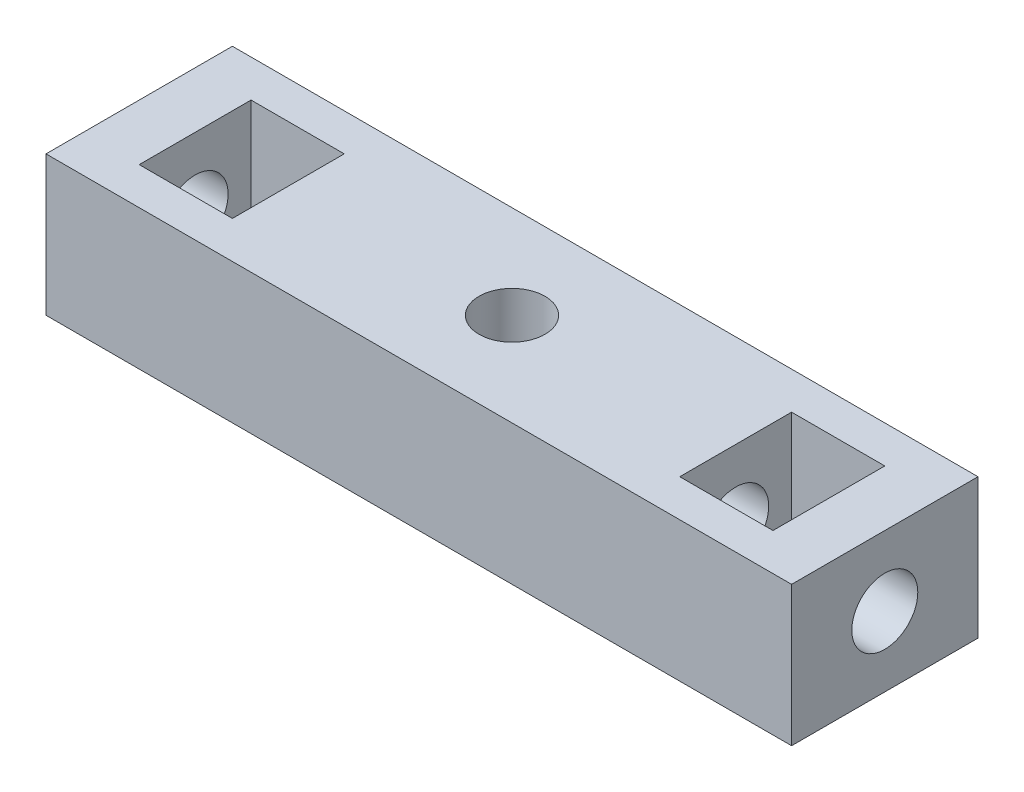
ISO-10303-21;
HEADER;
FILE_DESCRIPTION(('STEP AP214'),'2;1');
FILE_NAME('part.step','',(''),(''),'','','');
FILE_SCHEMA(('AUTOMOTIVE_DESIGN { 1 0 10303 214 1 1 1 1 }'));
ENDSEC;
DATA;
#1=APPLICATION_CONTEXT('core data for automotive mechanical design processes');
#2=APPLICATION_PROTOCOL_DEFINITION('international standard','automotive_design',2000,#1);
#3=PRODUCT_CONTEXT('',#1,'mechanical');
#4=PRODUCT('Part','Part','',(#3));
#5=PRODUCT_RELATED_PRODUCT_CATEGORY('part','',(#4));
#6=PRODUCT_DEFINITION_FORMATION('','',#4);
#7=PRODUCT_DEFINITION_CONTEXT('part definition',#1,'design');
#8=PRODUCT_DEFINITION('design','',#6,#7);
#9=PRODUCT_DEFINITION_SHAPE('','',#8);
#10=(LENGTH_UNIT() NAMED_UNIT(*) SI_UNIT(.MILLI.,.METRE.));
#11=(NAMED_UNIT(*) PLANE_ANGLE_UNIT() SI_UNIT($,.RADIAN.));
#12=(NAMED_UNIT(*) SI_UNIT($,.STERADIAN.) SOLID_ANGLE_UNIT());
#13=UNCERTAINTY_MEASURE_WITH_UNIT(LENGTH_MEASURE(1.E-05),#10,'distance_accuracy_value','');
#14=(GEOMETRIC_REPRESENTATION_CONTEXT(3) GLOBAL_UNCERTAINTY_ASSIGNED_CONTEXT((#13)) GLOBAL_UNIT_ASSIGNED_CONTEXT((#10,
#11,#12)) REPRESENTATION_CONTEXT('',''));
#15=CARTESIAN_POINT('',(0.,0.,0.));
#16=DIRECTION('',(0.,0.,1.));
#17=DIRECTION('',(1.,0.,0.));
#18=AXIS2_PLACEMENT_3D('',#15,#16,#17);
#19=CARTESIAN_POINT('',(25.4,4.7625,-57.15));
#20=DIRECTION('',(1.,0.,0.));
#21=DIRECTION('',(0.,0.,-1.));
#22=AXIS2_PLACEMENT_3D('',#19,#20,#21);
#23=CYLINDRICAL_SURFACE('',#22,2.24789999999999);
#24=CARTESIAN_POINT('',(21.59,4.7625,-57.15));
#25=DIRECTION('',(1.,0.,0.));
#26=DIRECTION('',(0.,0.,-1.));
#27=AXIS2_PLACEMENT_3D('',#24,#25,#26);
#28=CIRCLE('',#27,2.24789999999999);
#29=CARTESIAN_POINT('',(21.59,4.7625,-59.3979));
#30=VERTEX_POINT('',#29);
#31=EDGE_CURVE('E256',#30,#30,#28,.F.);
#32=ORIENTED_EDGE('',*,*,#31,.T.);
#33=EDGE_LOOP('',(#32));
#34=FACE_BOUND('',#33,.T.);
#35=CARTESIAN_POINT('',(25.4,4.7625,-57.15));
#36=DIRECTION('',(1.,0.,0.));
#37=DIRECTION('',(0.,0.,-1.));
#38=AXIS2_PLACEMENT_3D('',#35,#36,#37);
#39=CIRCLE('',#38,2.24789999999999);
#40=CARTESIAN_POINT('',(25.4,4.7625,-59.3979));
#41=VERTEX_POINT('',#40);
#42=EDGE_CURVE('E210',#41,#41,#39,.T.);
#43=ORIENTED_EDGE('',*,*,#42,.T.);
#44=EDGE_LOOP('',(#43));
#45=FACE_BOUND('',#44,.T.);
#46=ADVANCED_FACE('F42',(#34,#45),#23,.F.);
#47=CARTESIAN_POINT('',(25.4,9.525,63.5));
#48=DIRECTION('',(-1.,0.,0.));
#49=DIRECTION('',(0.,0.,1.));
#50=AXIS2_PLACEMENT_3D('',#47,#48,#49);
#51=PLANE('',#50);
#52=ORIENTED_EDGE('',*,*,#42,.F.);
#53=EDGE_LOOP('',(#52));
#54=FACE_BOUND('',#53,.T.);
#55=DIRECTION('',(0.,0.,-1.));
#56=VECTOR('',#55,1.);
#57=CARTESIAN_POINT('',(25.4,9.525,63.5));
#58=LINE('',#57,#56);
#59=CARTESIAN_POINT('',(25.4,9.525,-50.8));
#60=VERTEX_POINT('',#59);
#61=CARTESIAN_POINT('',(25.4,9.525,-63.5));
#62=VERTEX_POINT('',#61);
#63=EDGE_CURVE('E239',#60,#62,#58,.T.);
#64=ORIENTED_EDGE('',*,*,#63,.F.);
#65=DIRECTION('',(0.,1.,0.));
#66=VECTOR('',#65,1.);
#67=CARTESIAN_POINT('',(25.4,0.,-50.8));
#68=LINE('',#67,#66);
#69=CARTESIAN_POINT('',(25.4,0.,-50.8));
#70=VERTEX_POINT('',#69);
#71=EDGE_CURVE('E232',#70,#60,#68,.T.);
#72=ORIENTED_EDGE('',*,*,#71,.F.);
#73=DIRECTION('',(0.,0.,-1.));
#74=VECTOR('',#73,1.);
#75=CARTESIAN_POINT('',(25.4,0.,63.5));
#76=LINE('',#75,#74);
#77=CARTESIAN_POINT('',(25.4,0.,-63.5));
#78=VERTEX_POINT('',#77);
#79=EDGE_CURVE('E237',#70,#78,#76,.T.);
#80=ORIENTED_EDGE('',*,*,#79,.T.);
#81=DIRECTION('',(0.,-1.,0.));
#82=VECTOR('',#81,1.);
#83=CARTESIAN_POINT('',(25.4,9.525,-63.5));
#84=LINE('',#83,#82);
#85=EDGE_CURVE('E11',#62,#78,#84,.T.);
#86=ORIENTED_EDGE('',*,*,#85,.F.);
#87=EDGE_LOOP('',(#64,#72,#80,#86));
#88=FACE_BOUND('',#87,.T.);
#89=ADVANCED_FACE('F44',(#54,#88),#51,.F.);
#90=CARTESIAN_POINT('',(-25.4,9.525,-63.5));
#91=DIRECTION('',(0.,0.,1.));
#92=DIRECTION('',(1.,0.,0.));
#93=AXIS2_PLACEMENT_3D('',#90,#91,#92);
#94=PLANE('',#93);
#95=DIRECTION('',(-1.,0.,0.));
#96=VECTOR('',#95,1.);
#97=CARTESIAN_POINT('',(-25.4,0.,-63.5));
#98=LINE('',#97,#96);
#99=CARTESIAN_POINT('',(-25.4,0.,-63.5));
#100=VERTEX_POINT('',#99);
#101=EDGE_CURVE('E248',#78,#100,#98,.T.);
#102=ORIENTED_EDGE('',*,*,#101,.T.);
#103=DIRECTION('',(0.,-1.,0.));
#104=VECTOR('',#103,1.);
#105=CARTESIAN_POINT('',(-25.4,9.525,-63.5));
#106=LINE('',#105,#104);
#107=CARTESIAN_POINT('',(-25.4,9.525,-63.5));
#108=VERTEX_POINT('',#107);
#109=EDGE_CURVE('E51',#108,#100,#106,.T.);
#110=ORIENTED_EDGE('',*,*,#109,.F.);
#111=DIRECTION('',(-1.,0.,0.));
#112=VECTOR('',#111,1.);
#113=CARTESIAN_POINT('',(-25.4,9.525,-63.5));
#114=LINE('',#113,#112);
#115=EDGE_CURVE('E241',#62,#108,#114,.T.);
#116=ORIENTED_EDGE('',*,*,#115,.F.);
#117=ORIENTED_EDGE('',*,*,#85,.T.);
#118=EDGE_LOOP('',(#102,#110,#116,#117));
#119=FACE_BOUND('',#118,.T.);
#120=ADVANCED_FACE('F292',(#119),#94,.F.);
#121=CARTESIAN_POINT('',(-25.4,9.525,63.5));
#122=DIRECTION('',(1.,0.,0.));
#123=DIRECTION('',(0.,0.,-1.));
#124=AXIS2_PLACEMENT_3D('',#121,#122,#123);
#125=PLANE('',#124);
#126=CARTESIAN_POINT('',(-25.4,4.7625,-57.15));
#127=DIRECTION('',(-1.,0.,0.));
#128=DIRECTION('',(0.,0.,1.));
#129=AXIS2_PLACEMENT_3D('',#126,#127,#128);
#130=CIRCLE('',#129,2.24789999999999);
#131=CARTESIAN_POINT('',(-25.4,4.7625,-54.9021));
#132=VERTEX_POINT('',#131);
#133=EDGE_CURVE('E216',#132,#132,#130,.T.);
#134=ORIENTED_EDGE('',*,*,#133,.F.);
#135=EDGE_LOOP('',(#134));
#136=FACE_BOUND('',#135,.T.);
#137=DIRECTION('',(0.,0.,1.));
#138=VECTOR('',#137,1.);
#139=CARTESIAN_POINT('',(-25.4,0.,63.5));
#140=LINE('',#139,#138);
#141=CARTESIAN_POINT('',(-25.4,0.,-50.8));
#142=VERTEX_POINT('',#141);
#143=EDGE_CURVE('E242',#100,#142,#140,.T.);
#144=ORIENTED_EDGE('',*,*,#143,.T.);
#145=DIRECTION('',(0.,1.,0.));
#146=VECTOR('',#145,1.);
#147=CARTESIAN_POINT('',(-25.4,0.,-50.8));
#148=LINE('',#147,#146);
#149=CARTESIAN_POINT('',(-25.4,9.525,-50.8));
#150=VERTEX_POINT('',#149);
#151=EDGE_CURVE('E234',#142,#150,#148,.T.);
#152=ORIENTED_EDGE('',*,*,#151,.T.);
#153=DIRECTION('',(0.,0.,1.));
#154=VECTOR('',#153,1.);
#155=CARTESIAN_POINT('',(-25.4,9.525,63.5));
#156=LINE('',#155,#154);
#157=EDGE_CURVE('E244',#108,#150,#156,.T.);
#158=ORIENTED_EDGE('',*,*,#157,.F.);
#159=ORIENTED_EDGE('',*,*,#109,.T.);
#160=EDGE_LOOP('',(#144,#152,#158,#159));
#161=FACE_BOUND('',#160,.T.);
#162=ADVANCED_FACE('F344',(#136,#161),#125,.F.);
#163=CARTESIAN_POINT('',(0.,9.525,0.));
#164=DIRECTION('',(0.,-1.,0.));
#165=DIRECTION('',(0.,0.,-1.));
#166=AXIS2_PLACEMENT_3D('',#163,#164,#165);
#167=PLANE('',#166);
#168=DIRECTION('',(-1.,0.,0.));
#169=VECTOR('',#168,1.);
#170=CARTESIAN_POINT('',(-21.59,9.525,-60.96));
#171=LINE('',#170,#169);
#172=CARTESIAN_POINT('',(-15.24,9.525,-60.96));
#173=VERTEX_POINT('',#172);
#174=CARTESIAN_POINT('',(-21.59,9.525,-60.96));
#175=VERTEX_POINT('',#174);
#176=EDGE_CURVE('E170',#173,#175,#171,.T.);
#177=ORIENTED_EDGE('',*,*,#176,.F.);
#178=DIRECTION('',(0.,0.,-1.));
#179=VECTOR('',#178,1.);
#180=CARTESIAN_POINT('',(-15.24,9.525,-53.34));
#181=LINE('',#180,#179);
#182=CARTESIAN_POINT('',(-15.24,9.525,-53.34));
#183=VERTEX_POINT('',#182);
#184=EDGE_CURVE('E59',#183,#173,#181,.T.);
#185=ORIENTED_EDGE('',*,*,#184,.F.);
#186=DIRECTION('',(1.,0.,0.));
#187=VECTOR('',#186,1.);
#188=CARTESIAN_POINT('',(-21.59,9.525,-53.34));
#189=LINE('',#188,#187);
#190=CARTESIAN_POINT('',(-21.59,9.525,-53.34));
#191=VERTEX_POINT('',#190);
#192=EDGE_CURVE('E161',#191,#183,#189,.T.);
#193=ORIENTED_EDGE('',*,*,#192,.F.);
#194=DIRECTION('',(0.,0.,1.));
#195=VECTOR('',#194,1.);
#196=CARTESIAN_POINT('',(-21.59,9.525,-53.34));
#197=LINE('',#196,#195);
#198=EDGE_CURVE('E164',#175,#191,#197,.T.);
#199=ORIENTED_EDGE('',*,*,#198,.F.);
#200=EDGE_LOOP('',(#177,#185,#193,#199));
#201=FACE_BOUND('',#200,.T.);
#202=DIRECTION('',(-1.,0.,0.));
#203=VECTOR('',#202,1.);
#204=CARTESIAN_POINT('',(15.24,9.525,-60.96));
#205=LINE('',#204,#203);
#206=CARTESIAN_POINT('',(21.59,9.525,-60.96));
#207=VERTEX_POINT('',#206);
#208=CARTESIAN_POINT('',(15.24,9.525,-60.96));
#209=VERTEX_POINT('',#208);
#210=EDGE_CURVE('E196',#207,#209,#205,.T.);
#211=ORIENTED_EDGE('',*,*,#210,.F.);
#212=DIRECTION('',(0.,0.,-1.));
#213=VECTOR('',#212,1.);
#214=CARTESIAN_POINT('',(21.59,9.525,-53.34));
#215=LINE('',#214,#213);
#216=CARTESIAN_POINT('',(21.59,9.525,-53.34));
#217=VERTEX_POINT('',#216);
#218=EDGE_CURVE('E67',#217,#207,#215,.T.);
#219=ORIENTED_EDGE('',*,*,#218,.F.);
#220=DIRECTION('',(1.,0.,0.));
#221=VECTOR('',#220,1.);
#222=CARTESIAN_POINT('',(15.24,9.525,-53.34));
#223=LINE('',#222,#221);
#224=CARTESIAN_POINT('',(15.24,9.525,-53.34));
#225=VERTEX_POINT('',#224);
#226=EDGE_CURVE('E189',#225,#217,#223,.T.);
#227=ORIENTED_EDGE('',*,*,#226,.F.);
#228=DIRECTION('',(0.,0.,1.));
#229=VECTOR('',#228,1.);
#230=CARTESIAN_POINT('',(15.24,9.525,-53.34));
#231=LINE('',#230,#229);
#232=EDGE_CURVE('E192',#209,#225,#231,.T.);
#233=ORIENTED_EDGE('',*,*,#232,.F.);
#234=EDGE_LOOP('',(#211,#219,#227,#233));
#235=FACE_BOUND('',#234,.T.);
#236=CARTESIAN_POINT('',(0.,9.525,-57.15));
#237=DIRECTION('',(0.,1.,0.));
#238=DIRECTION('',(0.,0.,1.));
#239=AXIS2_PLACEMENT_3D('',#236,#237,#238);
#240=CIRCLE('',#239,2.2479);
#241=CARTESIAN_POINT('',(0.,9.525,-54.9021));
#242=VERTEX_POINT('',#241);
#243=EDGE_CURVE('E222',#242,#242,#240,.T.);
#244=ORIENTED_EDGE('',*,*,#243,.F.);
#245=EDGE_LOOP('',(#244));
#246=FACE_BOUND('',#245,.T.);
#247=ORIENTED_EDGE('',*,*,#157,.T.);
#248=DIRECTION('',(-1.,0.,0.));
#249=VECTOR('',#248,1.);
#250=CARTESIAN_POINT('',(-25.4,9.525,-50.8));
#251=LINE('',#250,#249);
#252=EDGE_CURVE('E228',#60,#150,#251,.T.);
#253=ORIENTED_EDGE('',*,*,#252,.F.);
#254=ORIENTED_EDGE('',*,*,#63,.T.);
#255=ORIENTED_EDGE('',*,*,#115,.T.);
#256=EDGE_LOOP('',(#247,#253,#254,#255));
#257=FACE_BOUND('',#256,.T.);
#258=ADVANCED_FACE('F326',(#201,#235,#246,#257),#167,.F.);
#259=CARTESIAN_POINT('',(0.,0.,0.));
#260=DIRECTION('',(0.,-1.,0.));
#261=DIRECTION('',(0.,0.,-1.));
#262=AXIS2_PLACEMENT_3D('',#259,#260,#261);
#263=PLANE('',#262);
#264=DIRECTION('',(0.,0.,-1.));
#265=VECTOR('',#264,1.);
#266=CARTESIAN_POINT('',(-15.24,0.,-53.34));
#267=LINE('',#266,#265);
#268=CARTESIAN_POINT('',(-15.24,0.,-53.34));
#269=VERTEX_POINT('',#268);
#270=CARTESIAN_POINT('',(-15.24,0.,-60.96));
#271=VERTEX_POINT('',#270);
#272=EDGE_CURVE('E142',#269,#271,#267,.T.);
#273=ORIENTED_EDGE('',*,*,#272,.T.);
#274=DIRECTION('',(-1.,0.,0.));
#275=VECTOR('',#274,1.);
#276=CARTESIAN_POINT('',(-21.59,0.,-60.96));
#277=LINE('',#276,#275);
#278=CARTESIAN_POINT('',(-21.59,0.,-60.96));
#279=VERTEX_POINT('',#278);
#280=EDGE_CURVE('E152',#271,#279,#277,.T.);
#281=ORIENTED_EDGE('',*,*,#280,.T.);
#282=DIRECTION('',(0.,0.,1.));
#283=VECTOR('',#282,1.);
#284=CARTESIAN_POINT('',(-21.59,0.,-53.34));
#285=LINE('',#284,#283);
#286=CARTESIAN_POINT('',(-21.59,0.,-53.34));
#287=VERTEX_POINT('',#286);
#288=EDGE_CURVE('E156',#279,#287,#285,.T.);
#289=ORIENTED_EDGE('',*,*,#288,.T.);
#290=DIRECTION('',(1.,0.,0.));
#291=VECTOR('',#290,1.);
#292=CARTESIAN_POINT('',(-21.59,0.,-53.34));
#293=LINE('',#292,#291);
#294=EDGE_CURVE('E148',#287,#269,#293,.T.);
#295=ORIENTED_EDGE('',*,*,#294,.T.);
#296=EDGE_LOOP('',(#273,#281,#289,#295));
#297=FACE_BOUND('',#296,.T.);
#298=DIRECTION('',(0.,0.,-1.));
#299=VECTOR('',#298,1.);
#300=CARTESIAN_POINT('',(21.59,0.,-53.34));
#301=LINE('',#300,#299);
#302=CARTESIAN_POINT('',(21.59,0.,-53.34));
#303=VERTEX_POINT('',#302);
#304=CARTESIAN_POINT('',(21.59,0.,-60.96));
#305=VERTEX_POINT('',#304);
#306=EDGE_CURVE('E193',#303,#305,#301,.T.);
#307=ORIENTED_EDGE('',*,*,#306,.T.);
#308=DIRECTION('',(-1.,0.,0.));
#309=VECTOR('',#308,1.);
#310=CARTESIAN_POINT('',(15.24,0.,-60.96));
#311=LINE('',#310,#309);
#312=CARTESIAN_POINT('',(15.24,0.,-60.96));
#313=VERTEX_POINT('',#312);
#314=EDGE_CURVE('E205',#305,#313,#311,.T.);
#315=ORIENTED_EDGE('',*,*,#314,.T.);
#316=DIRECTION('',(0.,0.,1.));
#317=VECTOR('',#316,1.);
#318=CARTESIAN_POINT('',(15.24,0.,-53.34));
#319=LINE('',#318,#317);
#320=CARTESIAN_POINT('',(15.24,0.,-53.34));
#321=VERTEX_POINT('',#320);
#322=EDGE_CURVE('E202',#313,#321,#319,.T.);
#323=ORIENTED_EDGE('',*,*,#322,.T.);
#324=DIRECTION('',(1.,0.,0.));
#325=VECTOR('',#324,1.);
#326=CARTESIAN_POINT('',(15.24,0.,-53.34));
#327=LINE('',#326,#325);
#328=EDGE_CURVE('E182',#321,#303,#327,.T.);
#329=ORIENTED_EDGE('',*,*,#328,.T.);
#330=EDGE_LOOP('',(#307,#315,#323,#329));
#331=FACE_BOUND('',#330,.T.);
#332=CARTESIAN_POINT('',(0.,0.,-57.15));
#333=DIRECTION('',(0.,1.,0.));
#334=DIRECTION('',(0.,0.,1.));
#335=AXIS2_PLACEMENT_3D('',#332,#333,#334);
#336=CIRCLE('',#335,2.2479);
#337=CARTESIAN_POINT('',(0.,0.,-54.9021));
#338=VERTEX_POINT('',#337);
#339=EDGE_CURVE('E225',#338,#338,#336,.T.);
#340=ORIENTED_EDGE('',*,*,#339,.T.);
#341=EDGE_LOOP('',(#340));
#342=FACE_BOUND('',#341,.T.);
#343=DIRECTION('',(-1.,0.,0.));
#344=VECTOR('',#343,1.);
#345=CARTESIAN_POINT('',(-25.4,0.,-50.8));
#346=LINE('',#345,#344);
#347=EDGE_CURVE('E229',#70,#142,#346,.T.);
#348=ORIENTED_EDGE('',*,*,#347,.T.);
#349=ORIENTED_EDGE('',*,*,#143,.F.);
#350=ORIENTED_EDGE('',*,*,#101,.F.);
#351=ORIENTED_EDGE('',*,*,#79,.F.);
#352=EDGE_LOOP('',(#348,#349,#350,#351));
#353=FACE_BOUND('',#352,.T.);
#354=ADVANCED_FACE('F158',(#297,#331,#342,#353),#263,.T.);
#355=CARTESIAN_POINT('',(-25.4,0.,-50.8));
#356=DIRECTION('',(0.,0.,-1.));
#357=DIRECTION('',(-1.,0.,0.));
#358=AXIS2_PLACEMENT_3D('',#355,#356,#357);
#359=PLANE('',#358);
#360=ORIENTED_EDGE('',*,*,#252,.T.);
#361=ORIENTED_EDGE('',*,*,#151,.F.);
#362=ORIENTED_EDGE('',*,*,#347,.F.);
#363=ORIENTED_EDGE('',*,*,#71,.T.);
#364=EDGE_LOOP('',(#360,#361,#362,#363));
#365=FACE_BOUND('',#364,.T.);
#366=ADVANCED_FACE('F334',(#365),#359,.F.);
#367=CARTESIAN_POINT('',(0.,9.525,-57.15));
#368=DIRECTION('',(0.,1.,0.));
#369=DIRECTION('',(0.,0.,1.));
#370=AXIS2_PLACEMENT_3D('',#367,#368,#369);
#371=CYLINDRICAL_SURFACE('',#370,2.2479);
#372=ORIENTED_EDGE('',*,*,#339,.F.);
#373=EDGE_LOOP('',(#372));
#374=FACE_BOUND('',#373,.T.);
#375=ORIENTED_EDGE('',*,*,#243,.T.);
#376=EDGE_LOOP('',(#375));
#377=FACE_BOUND('',#376,.T.);
#378=ADVANCED_FACE('F375',(#374,#377),#371,.F.);
#379=CARTESIAN_POINT('',(-25.4,4.7625,-57.15));
#380=DIRECTION('',(-1.,0.,0.));
#381=DIRECTION('',(0.,0.,1.));
#382=AXIS2_PLACEMENT_3D('',#379,#380,#381);
#383=CYLINDRICAL_SURFACE('',#382,2.24789999999999);
#384=CARTESIAN_POINT('',(-21.59,4.7625,-57.15));
#385=DIRECTION('',(-1.,0.,0.));
#386=DIRECTION('',(0.,0.,1.));
#387=AXIS2_PLACEMENT_3D('',#384,#385,#386);
#388=CIRCLE('',#387,2.24789999999999);
#389=CARTESIAN_POINT('',(-21.59,4.7625,-54.9021));
#390=VERTEX_POINT('',#389);
#391=EDGE_CURVE('E258',#390,#390,#388,.F.);
#392=ORIENTED_EDGE('',*,*,#391,.T.);
#393=EDGE_LOOP('',(#392));
#394=FACE_BOUND('',#393,.T.);
#395=ORIENTED_EDGE('',*,*,#133,.T.);
#396=EDGE_LOOP('',(#395));
#397=FACE_BOUND('',#396,.T.);
#398=ADVANCED_FACE('F319',(#394,#397),#383,.F.);
#399=CARTESIAN_POINT('',(21.59,0.,-53.34));
#400=DIRECTION('',(1.,0.,0.));
#401=DIRECTION('',(0.,0.,-1.));
#402=AXIS2_PLACEMENT_3D('',#399,#400,#401);
#403=PLANE('',#402);
#404=ORIENTED_EDGE('',*,*,#218,.T.);
#405=DIRECTION('',(0.,1.,0.));
#406=VECTOR('',#405,1.);
#407=CARTESIAN_POINT('',(21.59,0.,-60.96));
#408=LINE('',#407,#406);
#409=EDGE_CURVE('E180',#305,#207,#408,.T.);
#410=ORIENTED_EDGE('',*,*,#409,.F.);
#411=ORIENTED_EDGE('',*,*,#306,.F.);
#412=DIRECTION('',(0.,1.,0.));
#413=VECTOR('',#412,1.);
#414=CARTESIAN_POINT('',(21.59,0.,-53.34));
#415=LINE('',#414,#413);
#416=EDGE_CURVE('E187',#303,#217,#415,.T.);
#417=ORIENTED_EDGE('',*,*,#416,.T.);
#418=EDGE_LOOP('',(#404,#410,#411,#417));
#419=FACE_BOUND('',#418,.T.);
#420=ORIENTED_EDGE('',*,*,#31,.F.);
#421=EDGE_LOOP('',(#420));
#422=FACE_BOUND('',#421,.T.);
#423=ADVANCED_FACE('F311',(#419,#422),#403,.F.);
#424=CARTESIAN_POINT('',(15.24,0.,-53.34));
#425=DIRECTION('',(-1.,0.,0.));
#426=DIRECTION('',(0.,0.,1.));
#427=AXIS2_PLACEMENT_3D('',#424,#425,#426);
#428=PLANE('',#427);
#429=ORIENTED_EDGE('',*,*,#232,.T.);
#430=DIRECTION('',(0.,1.,0.));
#431=VECTOR('',#430,1.);
#432=CARTESIAN_POINT('',(15.24,0.,-53.34));
#433=LINE('',#432,#431);
#434=EDGE_CURVE('E185',#321,#225,#433,.T.);
#435=ORIENTED_EDGE('',*,*,#434,.F.);
#436=ORIENTED_EDGE('',*,*,#322,.F.);
#437=DIRECTION('',(0.,1.,0.));
#438=VECTOR('',#437,1.);
#439=CARTESIAN_POINT('',(15.24,0.,-60.96));
#440=LINE('',#439,#438);
#441=EDGE_CURVE('E183',#313,#209,#440,.T.);
#442=ORIENTED_EDGE('',*,*,#441,.T.);
#443=EDGE_LOOP('',(#429,#435,#436,#442));
#444=FACE_BOUND('',#443,.T.);
#445=CARTESIAN_POINT('',(15.24,4.7625,-57.15));
#446=DIRECTION('',(-1.,0.,0.));
#447=DIRECTION('',(0.,0.,1.));
#448=AXIS2_PLACEMENT_3D('',#445,#446,#447);
#449=CIRCLE('',#448,2.24789999999999);
#450=CARTESIAN_POINT('',(15.24,4.7625,-54.9021));
#451=VERTEX_POINT('',#450);
#452=EDGE_CURVE('E176',#451,#451,#449,.F.);
#453=ORIENTED_EDGE('',*,*,#452,.F.);
#454=EDGE_LOOP('',(#453));
#455=FACE_BOUND('',#454,.T.);
#456=ADVANCED_FACE('F309',(#444,#455),#428,.F.);
#457=CARTESIAN_POINT('',(15.24,0.,-53.34));
#458=DIRECTION('',(0.,0.,1.));
#459=DIRECTION('',(1.,0.,0.));
#460=AXIS2_PLACEMENT_3D('',#457,#458,#459);
#461=PLANE('',#460);
#462=ORIENTED_EDGE('',*,*,#226,.T.);
#463=ORIENTED_EDGE('',*,*,#416,.F.);
#464=ORIENTED_EDGE('',*,*,#328,.F.);
#465=ORIENTED_EDGE('',*,*,#434,.T.);
#466=EDGE_LOOP('',(#462,#463,#464,#465));
#467=FACE_BOUND('',#466,.T.);
#468=ADVANCED_FACE('F278',(#467),#461,.F.);
#469=CARTESIAN_POINT('',(15.24,0.,-60.96));
#470=DIRECTION('',(0.,0.,-1.));
#471=DIRECTION('',(-1.,0.,0.));
#472=AXIS2_PLACEMENT_3D('',#469,#470,#471);
#473=PLANE('',#472);
#474=ORIENTED_EDGE('',*,*,#210,.T.);
#475=ORIENTED_EDGE('',*,*,#441,.F.);
#476=ORIENTED_EDGE('',*,*,#314,.F.);
#477=ORIENTED_EDGE('',*,*,#409,.T.);
#478=EDGE_LOOP('',(#474,#475,#476,#477));
#479=FACE_BOUND('',#478,.T.);
#480=ADVANCED_FACE('F269',(#479),#473,.F.);
#481=CARTESIAN_POINT('',(-15.24,0.,-53.34));
#482=DIRECTION('',(1.,0.,0.));
#483=DIRECTION('',(0.,0.,-1.));
#484=AXIS2_PLACEMENT_3D('',#481,#482,#483);
#485=PLANE('',#484);
#486=ORIENTED_EDGE('',*,*,#184,.T.);
#487=DIRECTION('',(0.,1.,0.));
#488=VECTOR('',#487,1.);
#489=CARTESIAN_POINT('',(-15.24,0.,-60.96));
#490=LINE('',#489,#488);
#491=EDGE_CURVE('E137',#271,#173,#490,.T.);
#492=ORIENTED_EDGE('',*,*,#491,.F.);
#493=ORIENTED_EDGE('',*,*,#272,.F.);
#494=DIRECTION('',(0.,1.,0.));
#495=VECTOR('',#494,1.);
#496=CARTESIAN_POINT('',(-15.24,0.,-53.34));
#497=LINE('',#496,#495);
#498=EDGE_CURVE('E174',#269,#183,#497,.T.);
#499=ORIENTED_EDGE('',*,*,#498,.T.);
#500=EDGE_LOOP('',(#486,#492,#493,#499));
#501=FACE_BOUND('',#500,.T.);
#502=CARTESIAN_POINT('',(-15.24,4.7625,-57.15));
#503=DIRECTION('',(1.,0.,0.));
#504=DIRECTION('',(0.,0.,-1.));
#505=AXIS2_PLACEMENT_3D('',#502,#503,#504);
#506=CIRCLE('',#505,2.24789999999999);
#507=CARTESIAN_POINT('',(-15.24,4.7625,-59.3979));
#508=VERTEX_POINT('',#507);
#509=EDGE_CURVE('E46',#508,#508,#506,.F.);
#510=ORIENTED_EDGE('',*,*,#509,.F.);
#511=EDGE_LOOP('',(#510));
#512=FACE_BOUND('',#511,.T.);
#513=ADVANCED_FACE('F139',(#501,#512),#485,.F.);
#514=CARTESIAN_POINT('',(-21.59,0.,-53.34));
#515=DIRECTION('',(-1.,0.,0.));
#516=DIRECTION('',(0.,0.,1.));
#517=AXIS2_PLACEMENT_3D('',#514,#515,#516);
#518=PLANE('',#517);
#519=ORIENTED_EDGE('',*,*,#198,.T.);
#520=DIRECTION('',(0.,1.,0.));
#521=VECTOR('',#520,1.);
#522=CARTESIAN_POINT('',(-21.59,0.,-53.34));
#523=LINE('',#522,#521);
#524=EDGE_CURVE('E177',#287,#191,#523,.T.);
#525=ORIENTED_EDGE('',*,*,#524,.F.);
#526=ORIENTED_EDGE('',*,*,#288,.F.);
#527=DIRECTION('',(0.,1.,0.));
#528=VECTOR('',#527,1.);
#529=CARTESIAN_POINT('',(-21.59,0.,-60.96));
#530=LINE('',#529,#528);
#531=EDGE_CURVE('E147',#279,#175,#530,.T.);
#532=ORIENTED_EDGE('',*,*,#531,.T.);
#533=EDGE_LOOP('',(#519,#525,#526,#532));
#534=FACE_BOUND('',#533,.T.);
#535=ORIENTED_EDGE('',*,*,#391,.F.);
#536=EDGE_LOOP('',(#535));
#537=FACE_BOUND('',#536,.T.);
#538=ADVANCED_FACE('F268',(#534,#537),#518,.F.);
#539=CARTESIAN_POINT('',(-21.59,0.,-53.34));
#540=DIRECTION('',(0.,0.,1.));
#541=DIRECTION('',(1.,0.,0.));
#542=AXIS2_PLACEMENT_3D('',#539,#540,#541);
#543=PLANE('',#542);
#544=ORIENTED_EDGE('',*,*,#192,.T.);
#545=ORIENTED_EDGE('',*,*,#498,.F.);
#546=ORIENTED_EDGE('',*,*,#294,.F.);
#547=ORIENTED_EDGE('',*,*,#524,.T.);
#548=EDGE_LOOP('',(#544,#545,#546,#547));
#549=FACE_BOUND('',#548,.T.);
#550=ADVANCED_FACE('F275',(#549),#543,.F.);
#551=CARTESIAN_POINT('',(-21.59,0.,-60.96));
#552=DIRECTION('',(0.,0.,-1.));
#553=DIRECTION('',(-1.,0.,0.));
#554=AXIS2_PLACEMENT_3D('',#551,#552,#553);
#555=PLANE('',#554);
#556=ORIENTED_EDGE('',*,*,#176,.T.);
#557=ORIENTED_EDGE('',*,*,#531,.F.);
#558=ORIENTED_EDGE('',*,*,#280,.F.);
#559=ORIENTED_EDGE('',*,*,#491,.T.);
#560=EDGE_LOOP('',(#556,#557,#558,#559));
#561=FACE_BOUND('',#560,.T.);
#562=ADVANCED_FACE('F153',(#561),#555,.F.);
#563=CARTESIAN_POINT('',(-11.43,4.7625,-57.15));
#564=DIRECTION('',(-1.,0.,0.));
#565=DIRECTION('',(0.,0.,1.));
#566=AXIS2_PLACEMENT_3D('',#563,#564,#565);
#567=CONICAL_SURFACE('',#566,2.2479,1.02974425867665);
#568=CARTESIAN_POINT('',(-10.079325414488,4.7625,-57.15));
#569=VERTEX_POINT('',#568);
#570=VERTEX_LOOP('',#569);
#571=FACE_BOUND('',#570,.T.);
#572=CARTESIAN_POINT('',(-11.43,4.7625,-57.15));
#573=DIRECTION('',(-1.,0.,0.));
#574=DIRECTION('',(0.,0.,1.));
#575=AXIS2_PLACEMENT_3D('',#572,#573,#574);
#576=CIRCLE('',#575,2.2479);
#577=CARTESIAN_POINT('',(-11.43,4.7625,-54.9021));
#578=VERTEX_POINT('',#577);
#579=EDGE_CURVE('E219',#578,#578,#576,.T.);
#580=ORIENTED_EDGE('',*,*,#579,.T.);
#581=EDGE_LOOP('',(#580));
#582=FACE_BOUND('',#581,.T.);
#583=ADVANCED_FACE('F392',(#571,#582),#567,.F.);
#584=ORIENTED_EDGE('',*,*,#509,.T.);
#585=EDGE_LOOP('',(#584));
#586=FACE_BOUND('',#585,.T.);
#587=ORIENTED_EDGE('',*,*,#579,.F.);
#588=EDGE_LOOP('',(#587));
#589=FACE_BOUND('',#588,.T.);
#590=ADVANCED_FACE('F265',(#586,#589),#383,.F.);
#591=CARTESIAN_POINT('',(11.43,4.7625,-57.15));
#592=DIRECTION('',(1.,0.,0.));
#593=DIRECTION('',(0.,0.,-1.));
#594=AXIS2_PLACEMENT_3D('',#591,#592,#593);
#595=CONICAL_SURFACE('',#594,2.24789999999999,1.02974425867665);
#596=CARTESIAN_POINT('',(10.0793254144879,4.7625,-57.15));
#597=VERTEX_POINT('',#596);
#598=VERTEX_LOOP('',#597);
#599=FACE_BOUND('',#598,.T.);
#600=CARTESIAN_POINT('',(11.43,4.7625,-57.15));
#601=DIRECTION('',(1.,0.,0.));
#602=DIRECTION('',(0.,0.,-1.));
#603=AXIS2_PLACEMENT_3D('',#600,#601,#602);
#604=CIRCLE('',#603,2.24789999999999);
#605=CARTESIAN_POINT('',(11.43,4.7625,-59.3979));
#606=VERTEX_POINT('',#605);
#607=EDGE_CURVE('E213',#606,#606,#604,.T.);
#608=ORIENTED_EDGE('',*,*,#607,.T.);
#609=EDGE_LOOP('',(#608));
#610=FACE_BOUND('',#609,.T.);
#611=ADVANCED_FACE('F298',(#599,#610),#595,.F.);
#612=ORIENTED_EDGE('',*,*,#452,.T.);
#613=EDGE_LOOP('',(#612));
#614=FACE_BOUND('',#613,.T.);
#615=ORIENTED_EDGE('',*,*,#607,.F.);
#616=EDGE_LOOP('',(#615));
#617=FACE_BOUND('',#616,.T.);
#618=ADVANCED_FACE('F286',(#614,#617),#23,.F.);
#619=CLOSED_SHELL('',(#46,#89,#120,#162,#258,#354,#366,#378,#398,#423,#456,#468,#480,#513,#538,
#550,#562,#583,#590,#611,#618));
#620=MANIFOLD_SOLID_BREP('B2',#619);
#621=ADVANCED_BREP_SHAPE_REPRESENTATION('',(#18,#620),#14);
#622=SHAPE_DEFINITION_REPRESENTATION(#9,#621);
ENDSEC;
END-ISO-10303-21;
